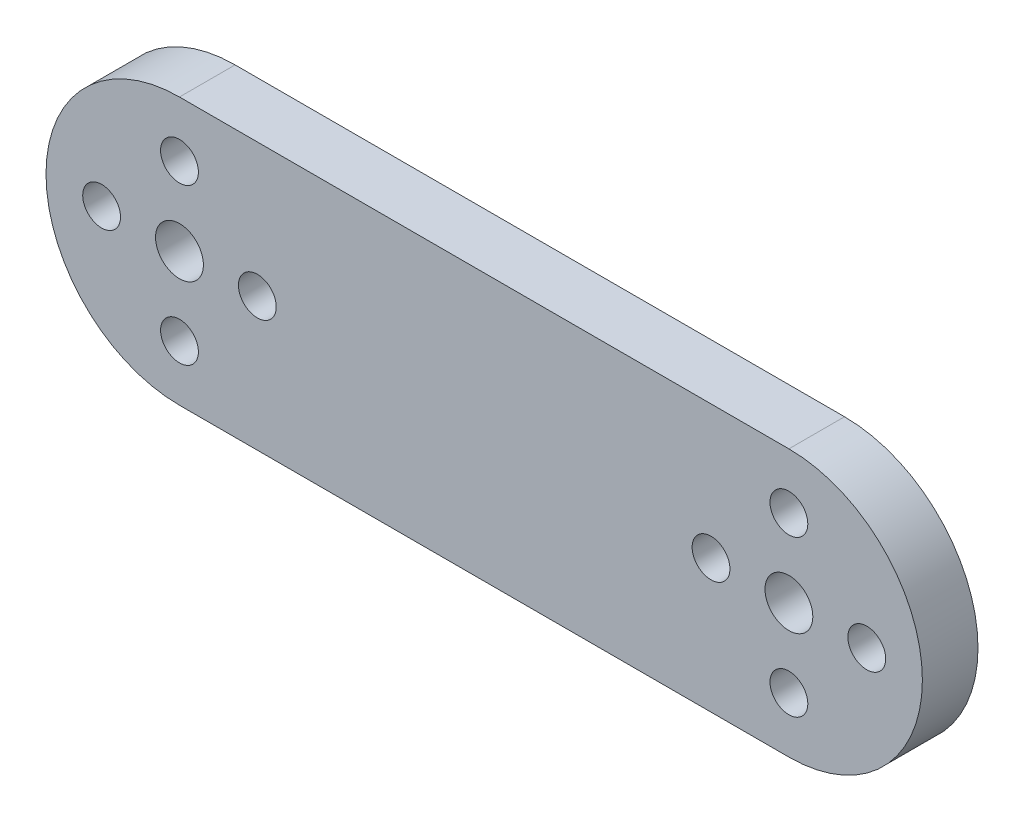
ISO-10303-21;
HEADER;
FILE_DESCRIPTION(('STEP AP214'),'2;1');
FILE_NAME('part.step','',(''),(''),'','','');
FILE_SCHEMA(('AUTOMOTIVE_DESIGN { 1 0 10303 214 1 1 1 1 }'));
ENDSEC;
DATA;
#1=APPLICATION_CONTEXT('core data for automotive mechanical design processes');
#2=APPLICATION_PROTOCOL_DEFINITION('international standard','automotive_design',2000,#1);
#3=PRODUCT_CONTEXT('',#1,'mechanical');
#4=PRODUCT('Part','Part','',(#3));
#5=PRODUCT_RELATED_PRODUCT_CATEGORY('part','',(#4));
#6=PRODUCT_DEFINITION_FORMATION('','',#4);
#7=PRODUCT_DEFINITION_CONTEXT('part definition',#1,'design');
#8=PRODUCT_DEFINITION('design','',#6,#7);
#9=PRODUCT_DEFINITION_SHAPE('','',#8);
#10=(LENGTH_UNIT() NAMED_UNIT(*) SI_UNIT(.MILLI.,.METRE.));
#11=(NAMED_UNIT(*) PLANE_ANGLE_UNIT() SI_UNIT($,.RADIAN.));
#12=(NAMED_UNIT(*) SI_UNIT($,.STERADIAN.) SOLID_ANGLE_UNIT());
#13=UNCERTAINTY_MEASURE_WITH_UNIT(LENGTH_MEASURE(1.E-05),#10,'distance_accuracy_value','');
#14=(GEOMETRIC_REPRESENTATION_CONTEXT(3) GLOBAL_UNCERTAINTY_ASSIGNED_CONTEXT((#13)) GLOBAL_UNIT_ASSIGNED_CONTEXT((#10,
#11,#12)) REPRESENTATION_CONTEXT('',''));
#15=CARTESIAN_POINT('',(0.,0.,0.));
#16=DIRECTION('',(0.,0.,1.));
#17=DIRECTION('',(1.,0.,0.));
#18=AXIS2_PLACEMENT_3D('',#15,#16,#17);
#19=CARTESIAN_POINT('',(0.,0.,5.));
#20=DIRECTION('',(0.,0.,1.));
#21=DIRECTION('',(1.,0.,0.));
#22=AXIS2_PLACEMENT_3D('',#19,#20,#21);
#23=PLANE('',#22);
#24=CARTESIAN_POINT('',(-54.7847500494002,0.,5.));
#25=DIRECTION('',(0.,0.,1.));
#26=DIRECTION('',(-1.,0.,0.));
#27=AXIS2_PLACEMENT_3D('',#24,#25,#26);
#28=CIRCLE('',#27,2.15);
#29=CARTESIAN_POINT('',(-56.9347500494002,0.,5.));
#30=VERTEX_POINT('',#29);
#31=EDGE_CURVE('E192',#30,#30,#28,.T.);
#32=ORIENTED_EDGE('',*,*,#31,.F.);
#33=EDGE_LOOP('',(#32));
#34=FACE_BOUND('',#33,.T.);
#35=CARTESIAN_POINT('',(-54.7847500494002,-7.00102849587125,5.));
#36=DIRECTION('',(0.,0.,1.));
#37=DIRECTION('',(-1.,0.,0.));
#38=AXIS2_PLACEMENT_3D('',#35,#36,#37);
#39=CIRCLE('',#38,1.7);
#40=CARTESIAN_POINT('',(-56.4847500494002,-7.00102849587125,5.));
#41=VERTEX_POINT('',#40);
#42=EDGE_CURVE('E176',#41,#41,#39,.T.);
#43=ORIENTED_EDGE('',*,*,#42,.F.);
#44=EDGE_LOOP('',(#43));
#45=FACE_BOUND('',#44,.T.);
#46=CARTESIAN_POINT('',(-7.00102849587125,0.,5.));
#47=DIRECTION('',(0.,0.,1.));
#48=DIRECTION('',(1.,0.,0.));
#49=AXIS2_PLACEMENT_3D('',#46,#47,#48);
#50=CIRCLE('',#49,1.7);
#51=CARTESIAN_POINT('',(-5.30102849587125,0.,5.));
#52=VERTEX_POINT('',#51);
#53=EDGE_CURVE('E160',#52,#52,#50,.T.);
#54=ORIENTED_EDGE('',*,*,#53,.F.);
#55=EDGE_LOOP('',(#54));
#56=FACE_BOUND('',#55,.T.);
#57=CARTESIAN_POINT('',(7.00102849587125,0.,5.));
#58=DIRECTION('',(0.,0.,1.));
#59=DIRECTION('',(1.,0.,0.));
#60=AXIS2_PLACEMENT_3D('',#57,#58,#59);
#61=CIRCLE('',#60,1.7);
#62=CARTESIAN_POINT('',(8.70102849587125,0.,5.));
#63=VERTEX_POINT('',#62);
#64=EDGE_CURVE('E144',#63,#63,#61,.T.);
#65=ORIENTED_EDGE('',*,*,#64,.F.);
#66=EDGE_LOOP('',(#65));
#67=FACE_BOUND('',#66,.T.);
#68=CARTESIAN_POINT('',(0.,0.,5.));
#69=DIRECTION('',(0.,0.,1.));
#70=DIRECTION('',(1.,0.,0.));
#71=AXIS2_PLACEMENT_3D('',#68,#69,#70);
#72=CIRCLE('',#71,2.15);
#73=CARTESIAN_POINT('',(2.15,0.,5.));
#74=VERTEX_POINT('',#73);
#75=EDGE_CURVE('E112',#74,#74,#72,.T.);
#76=ORIENTED_EDGE('',*,*,#75,.F.);
#77=EDGE_LOOP('',(#76));
#78=FACE_BOUND('',#77,.T.);
#79=CARTESIAN_POINT('',(0.,0.,5.));
#80=DIRECTION('',(0.,0.,1.));
#81=DIRECTION('',(1.,0.,0.));
#82=AXIS2_PLACEMENT_3D('',#79,#80,#81);
#83=CIRCLE('',#82,12.);
#84=CARTESIAN_POINT('',(0.,-12.,5.));
#85=VERTEX_POINT('',#84);
#86=CARTESIAN_POINT('',(0.,12.,5.));
#87=VERTEX_POINT('',#86);
#88=EDGE_CURVE('E91',#85,#87,#83,.T.);
#89=ORIENTED_EDGE('',*,*,#88,.T.);
#90=DIRECTION('',(-1.,0.,0.));
#91=VECTOR('',#90,1.);
#92=CARTESIAN_POINT('',(0.,12.,5.));
#93=LINE('',#92,#91);
#94=CARTESIAN_POINT('',(-54.7847500494002,12.,5.));
#95=VERTEX_POINT('',#94);
#96=EDGE_CURVE('E86',#87,#95,#93,.T.);
#97=ORIENTED_EDGE('',*,*,#96,.T.);
#98=CARTESIAN_POINT('',(-54.7847500494002,0.,5.));
#99=DIRECTION('',(0.,0.,1.));
#100=DIRECTION('',(1.,0.,0.));
#101=AXIS2_PLACEMENT_3D('',#98,#99,#100);
#102=CIRCLE('',#101,12.);
#103=CARTESIAN_POINT('',(-54.7847500494002,-12.,5.));
#104=VERTEX_POINT('',#103);
#105=EDGE_CURVE('E89',#95,#104,#102,.T.);
#106=ORIENTED_EDGE('',*,*,#105,.T.);
#107=DIRECTION('',(1.,0.,0.));
#108=VECTOR('',#107,1.);
#109=CARTESIAN_POINT('',(0.,-12.,5.));
#110=LINE('',#109,#108);
#111=EDGE_CURVE('E56',#104,#85,#110,.T.);
#112=ORIENTED_EDGE('',*,*,#111,.T.);
#113=EDGE_LOOP('',(#89,#97,#106,#112));
#114=FACE_BOUND('',#113,.T.);
#115=CARTESIAN_POINT('',(0.,7.00102849587125,5.));
#116=DIRECTION('',(0.,0.,1.));
#117=DIRECTION('',(1.,0.,0.));
#118=AXIS2_PLACEMENT_3D('',#115,#116,#117);
#119=CIRCLE('',#118,1.7);
#120=CARTESIAN_POINT('',(1.7,7.00102849587125,5.));
#121=VERTEX_POINT('',#120);
#122=EDGE_CURVE('E136',#121,#121,#119,.T.);
#123=ORIENTED_EDGE('',*,*,#122,.F.);
#124=EDGE_LOOP('',(#123));
#125=FACE_BOUND('',#124,.T.);
#126=CARTESIAN_POINT('',(0.,-7.00102849587125,5.));
#127=DIRECTION('',(0.,0.,1.));
#128=DIRECTION('',(1.,0.,0.));
#129=AXIS2_PLACEMENT_3D('',#126,#127,#128);
#130=CIRCLE('',#129,1.7);
#131=CARTESIAN_POINT('',(1.7,-7.00102849587125,5.));
#132=VERTEX_POINT('',#131);
#133=EDGE_CURVE('E152',#132,#132,#130,.T.);
#134=ORIENTED_EDGE('',*,*,#133,.F.);
#135=EDGE_LOOP('',(#134));
#136=FACE_BOUND('',#135,.T.);
#137=CARTESIAN_POINT('',(-47.7837215535289,0.,5.));
#138=DIRECTION('',(0.,0.,1.));
#139=DIRECTION('',(-1.,0.,0.));
#140=AXIS2_PLACEMENT_3D('',#137,#138,#139);
#141=CIRCLE('',#140,1.7);
#142=CARTESIAN_POINT('',(-49.4837215535289,0.,5.));
#143=VERTEX_POINT('',#142);
#144=EDGE_CURVE('E168',#143,#143,#141,.T.);
#145=ORIENTED_EDGE('',*,*,#144,.F.);
#146=EDGE_LOOP('',(#145));
#147=FACE_BOUND('',#146,.T.);
#148=CARTESIAN_POINT('',(-61.7857785452714,0.,5.));
#149=DIRECTION('',(0.,0.,1.));
#150=DIRECTION('',(-1.,0.,0.));
#151=AXIS2_PLACEMENT_3D('',#148,#149,#150);
#152=CIRCLE('',#151,1.7);
#153=CARTESIAN_POINT('',(-63.4857785452714,0.,5.));
#154=VERTEX_POINT('',#153);
#155=EDGE_CURVE('E184',#154,#154,#152,.T.);
#156=ORIENTED_EDGE('',*,*,#155,.F.);
#157=EDGE_LOOP('',(#156));
#158=FACE_BOUND('',#157,.T.);
#159=CARTESIAN_POINT('',(-54.7847500494002,7.00102849587124,5.));
#160=DIRECTION('',(0.,0.,1.));
#161=DIRECTION('',(-1.,0.,0.));
#162=AXIS2_PLACEMENT_3D('',#159,#160,#161);
#163=CIRCLE('',#162,1.7);
#164=CARTESIAN_POINT('',(-56.4847500494002,7.00102849587124,5.));
#165=VERTEX_POINT('',#164);
#166=EDGE_CURVE('E200',#165,#165,#163,.T.);
#167=ORIENTED_EDGE('',*,*,#166,.F.);
#168=EDGE_LOOP('',(#167));
#169=FACE_BOUND('',#168,.T.);
#170=ADVANCED_FACE('F38',(#34,#45,#56,#67,#78,#114,#125,#136,#147,#158,#169),#23,.T.);
#171=CARTESIAN_POINT('',(0.,0.,0.));
#172=DIRECTION('',(0.,0.,1.));
#173=DIRECTION('',(1.,0.,0.));
#174=AXIS2_PLACEMENT_3D('',#171,#172,#173);
#175=PLANE('',#174);
#176=CARTESIAN_POINT('',(0.,0.,0.));
#177=DIRECTION('',(0.,0.,1.));
#178=DIRECTION('',(1.,0.,0.));
#179=AXIS2_PLACEMENT_3D('',#176,#177,#178);
#180=CIRCLE('',#179,12.);
#181=CARTESIAN_POINT('',(0.,-12.,0.));
#182=VERTEX_POINT('',#181);
#183=CARTESIAN_POINT('',(0.,12.,0.));
#184=VERTEX_POINT('',#183);
#185=EDGE_CURVE('E108',#182,#184,#180,.T.);
#186=ORIENTED_EDGE('',*,*,#185,.F.);
#187=DIRECTION('',(1.,0.,0.));
#188=VECTOR('',#187,1.);
#189=CARTESIAN_POINT('',(0.,-12.,0.));
#190=LINE('',#189,#188);
#191=CARTESIAN_POINT('',(-54.7847500494002,-12.,0.));
#192=VERTEX_POINT('',#191);
#193=EDGE_CURVE('E79',#192,#182,#190,.T.);
#194=ORIENTED_EDGE('',*,*,#193,.F.);
#195=CARTESIAN_POINT('',(-54.7847500494002,0.,0.));
#196=DIRECTION('',(0.,0.,1.));
#197=DIRECTION('',(1.,0.,0.));
#198=AXIS2_PLACEMENT_3D('',#195,#196,#197);
#199=CIRCLE('',#198,12.);
#200=CARTESIAN_POINT('',(-54.7847500494002,12.,0.));
#201=VERTEX_POINT('',#200);
#202=EDGE_CURVE('E73',#201,#192,#199,.T.);
#203=ORIENTED_EDGE('',*,*,#202,.F.);
#204=DIRECTION('',(-1.,0.,0.));
#205=VECTOR('',#204,1.);
#206=CARTESIAN_POINT('',(0.,12.,0.));
#207=LINE('',#206,#205);
#208=EDGE_CURVE('E96',#184,#201,#207,.T.);
#209=ORIENTED_EDGE('',*,*,#208,.F.);
#210=EDGE_LOOP('',(#186,#194,#203,#209));
#211=FACE_BOUND('',#210,.T.);
#212=CARTESIAN_POINT('',(0.,0.,0.));
#213=DIRECTION('',(0.,0.,1.));
#214=DIRECTION('',(1.,0.,0.));
#215=AXIS2_PLACEMENT_3D('',#212,#213,#214);
#216=CIRCLE('',#215,2.15);
#217=CARTESIAN_POINT('',(2.15,0.,0.));
#218=VERTEX_POINT('',#217);
#219=EDGE_CURVE('E132',#218,#218,#216,.T.);
#220=ORIENTED_EDGE('',*,*,#219,.T.);
#221=EDGE_LOOP('',(#220));
#222=FACE_BOUND('',#221,.T.);
#223=CARTESIAN_POINT('',(0.,7.00102849587125,0.));
#224=DIRECTION('',(0.,0.,1.));
#225=DIRECTION('',(1.,0.,0.));
#226=AXIS2_PLACEMENT_3D('',#223,#224,#225);
#227=CIRCLE('',#226,1.7);
#228=CARTESIAN_POINT('',(1.7,7.00102849587125,0.));
#229=VERTEX_POINT('',#228);
#230=EDGE_CURVE('E140',#229,#229,#227,.T.);
#231=ORIENTED_EDGE('',*,*,#230,.T.);
#232=EDGE_LOOP('',(#231));
#233=FACE_BOUND('',#232,.T.);
#234=CARTESIAN_POINT('',(7.00102849587125,0.,0.));
#235=DIRECTION('',(0.,0.,1.));
#236=DIRECTION('',(1.,0.,0.));
#237=AXIS2_PLACEMENT_3D('',#234,#235,#236);
#238=CIRCLE('',#237,1.7);
#239=CARTESIAN_POINT('',(8.70102849587125,0.,0.));
#240=VERTEX_POINT('',#239);
#241=EDGE_CURVE('E148',#240,#240,#238,.T.);
#242=ORIENTED_EDGE('',*,*,#241,.T.);
#243=EDGE_LOOP('',(#242));
#244=FACE_BOUND('',#243,.T.);
#245=CARTESIAN_POINT('',(0.,-7.00102849587125,0.));
#246=DIRECTION('',(0.,0.,1.));
#247=DIRECTION('',(1.,0.,0.));
#248=AXIS2_PLACEMENT_3D('',#245,#246,#247);
#249=CIRCLE('',#248,1.7);
#250=CARTESIAN_POINT('',(1.7,-7.00102849587125,0.));
#251=VERTEX_POINT('',#250);
#252=EDGE_CURVE('E156',#251,#251,#249,.T.);
#253=ORIENTED_EDGE('',*,*,#252,.T.);
#254=EDGE_LOOP('',(#253));
#255=FACE_BOUND('',#254,.T.);
#256=CARTESIAN_POINT('',(-7.00102849587125,0.,0.));
#257=DIRECTION('',(0.,0.,1.));
#258=DIRECTION('',(1.,0.,0.));
#259=AXIS2_PLACEMENT_3D('',#256,#257,#258);
#260=CIRCLE('',#259,1.7);
#261=CARTESIAN_POINT('',(-5.30102849587125,0.,0.));
#262=VERTEX_POINT('',#261);
#263=EDGE_CURVE('E164',#262,#262,#260,.T.);
#264=ORIENTED_EDGE('',*,*,#263,.T.);
#265=EDGE_LOOP('',(#264));
#266=FACE_BOUND('',#265,.T.);
#267=CARTESIAN_POINT('',(-47.7837215535289,0.,0.));
#268=DIRECTION('',(0.,0.,1.));
#269=DIRECTION('',(-1.,0.,0.));
#270=AXIS2_PLACEMENT_3D('',#267,#268,#269);
#271=CIRCLE('',#270,1.7);
#272=CARTESIAN_POINT('',(-49.4837215535289,0.,0.));
#273=VERTEX_POINT('',#272);
#274=EDGE_CURVE('E172',#273,#273,#271,.T.);
#275=ORIENTED_EDGE('',*,*,#274,.T.);
#276=EDGE_LOOP('',(#275));
#277=FACE_BOUND('',#276,.T.);
#278=CARTESIAN_POINT('',(-54.7847500494002,-7.00102849587125,0.));
#279=DIRECTION('',(0.,0.,1.));
#280=DIRECTION('',(-1.,0.,0.));
#281=AXIS2_PLACEMENT_3D('',#278,#279,#280);
#282=CIRCLE('',#281,1.7);
#283=CARTESIAN_POINT('',(-56.4847500494002,-7.00102849587125,0.));
#284=VERTEX_POINT('',#283);
#285=EDGE_CURVE('E180',#284,#284,#282,.T.);
#286=ORIENTED_EDGE('',*,*,#285,.T.);
#287=EDGE_LOOP('',(#286));
#288=FACE_BOUND('',#287,.T.);
#289=CARTESIAN_POINT('',(-61.7857785452714,0.,0.));
#290=DIRECTION('',(0.,0.,1.));
#291=DIRECTION('',(-1.,0.,0.));
#292=AXIS2_PLACEMENT_3D('',#289,#290,#291);
#293=CIRCLE('',#292,1.7);
#294=CARTESIAN_POINT('',(-63.4857785452714,0.,0.));
#295=VERTEX_POINT('',#294);
#296=EDGE_CURVE('E188',#295,#295,#293,.T.);
#297=ORIENTED_EDGE('',*,*,#296,.T.);
#298=EDGE_LOOP('',(#297));
#299=FACE_BOUND('',#298,.T.);
#300=CARTESIAN_POINT('',(-54.7847500494002,0.,0.));
#301=DIRECTION('',(0.,0.,1.));
#302=DIRECTION('',(-1.,0.,0.));
#303=AXIS2_PLACEMENT_3D('',#300,#301,#302);
#304=CIRCLE('',#303,2.15);
#305=CARTESIAN_POINT('',(-56.9347500494002,0.,0.));
#306=VERTEX_POINT('',#305);
#307=EDGE_CURVE('E196',#306,#306,#304,.T.);
#308=ORIENTED_EDGE('',*,*,#307,.T.);
#309=EDGE_LOOP('',(#308));
#310=FACE_BOUND('',#309,.T.);
#311=CARTESIAN_POINT('',(-54.7847500494002,7.00102849587124,0.));
#312=DIRECTION('',(0.,0.,1.));
#313=DIRECTION('',(-1.,0.,0.));
#314=AXIS2_PLACEMENT_3D('',#311,#312,#313);
#315=CIRCLE('',#314,1.7);
#316=CARTESIAN_POINT('',(-56.4847500494002,7.00102849587124,0.));
#317=VERTEX_POINT('',#316);
#318=EDGE_CURVE('E204',#317,#317,#315,.T.);
#319=ORIENTED_EDGE('',*,*,#318,.T.);
#320=EDGE_LOOP('',(#319));
#321=FACE_BOUND('',#320,.T.);
#322=ADVANCED_FACE('F126',(#211,#222,#233,#244,#255,#266,#277,#288,#299,#310,#321),#175,.F.);
#323=CARTESIAN_POINT('',(0.,0.,5.));
#324=DIRECTION('',(0.,0.,-1.));
#325=DIRECTION('',(-1.,0.,0.));
#326=AXIS2_PLACEMENT_3D('',#323,#324,#325);
#327=CYLINDRICAL_SURFACE('',#326,12.);
#328=ORIENTED_EDGE('',*,*,#185,.T.);
#329=DIRECTION('',(0.,0.,-1.));
#330=VECTOR('',#329,1.);
#331=CARTESIAN_POINT('',(0.,12.,5.));
#332=LINE('',#331,#330);
#333=EDGE_CURVE('E11',#87,#184,#332,.T.);
#334=ORIENTED_EDGE('',*,*,#333,.F.);
#335=ORIENTED_EDGE('',*,*,#88,.F.);
#336=DIRECTION('',(0.,0.,-1.));
#337=VECTOR('',#336,1.);
#338=CARTESIAN_POINT('',(0.,-12.,5.));
#339=LINE('',#338,#337);
#340=EDGE_CURVE('E104',#85,#182,#339,.T.);
#341=ORIENTED_EDGE('',*,*,#340,.T.);
#342=EDGE_LOOP('',(#328,#334,#335,#341));
#343=FACE_BOUND('',#342,.T.);
#344=ADVANCED_FACE('F40',(#343),#327,.T.);
#345=CARTESIAN_POINT('',(0.,12.,5.));
#346=DIRECTION('',(0.,-1.,0.));
#347=DIRECTION('',(1.,0.,0.));
#348=AXIS2_PLACEMENT_3D('',#345,#346,#347);
#349=PLANE('',#348);
#350=ORIENTED_EDGE('',*,*,#208,.T.);
#351=DIRECTION('',(0.,0.,-1.));
#352=VECTOR('',#351,1.);
#353=CARTESIAN_POINT('',(-54.7847500494002,12.,5.));
#354=LINE('',#353,#352);
#355=EDGE_CURVE('E48',#95,#201,#354,.T.);
#356=ORIENTED_EDGE('',*,*,#355,.F.);
#357=ORIENTED_EDGE('',*,*,#96,.F.);
#358=ORIENTED_EDGE('',*,*,#333,.T.);
#359=EDGE_LOOP('',(#350,#356,#357,#358));
#360=FACE_BOUND('',#359,.T.);
#361=ADVANCED_FACE('F95',(#360),#349,.F.);
#362=CARTESIAN_POINT('',(-54.7847500494002,0.,5.));
#363=DIRECTION('',(0.,0.,-1.));
#364=DIRECTION('',(-1.,0.,0.));
#365=AXIS2_PLACEMENT_3D('',#362,#363,#364);
#366=CYLINDRICAL_SURFACE('',#365,12.);
#367=ORIENTED_EDGE('',*,*,#202,.T.);
#368=DIRECTION('',(0.,0.,-1.));
#369=VECTOR('',#368,1.);
#370=CARTESIAN_POINT('',(-54.7847500494002,-12.,5.));
#371=LINE('',#370,#369);
#372=EDGE_CURVE('E98',#104,#192,#371,.T.);
#373=ORIENTED_EDGE('',*,*,#372,.F.);
#374=ORIENTED_EDGE('',*,*,#105,.F.);
#375=ORIENTED_EDGE('',*,*,#355,.T.);
#376=EDGE_LOOP('',(#367,#373,#374,#375));
#377=FACE_BOUND('',#376,.T.);
#378=ADVANCED_FACE('F99',(#377),#366,.T.);
#379=CARTESIAN_POINT('',(0.,-12.,5.));
#380=DIRECTION('',(0.,1.,0.));
#381=DIRECTION('',(0.,0.,1.));
#382=AXIS2_PLACEMENT_3D('',#379,#380,#381);
#383=PLANE('',#382);
#384=ORIENTED_EDGE('',*,*,#193,.T.);
#385=ORIENTED_EDGE('',*,*,#340,.F.);
#386=ORIENTED_EDGE('',*,*,#111,.F.);
#387=ORIENTED_EDGE('',*,*,#372,.T.);
#388=EDGE_LOOP('',(#384,#385,#386,#387));
#389=FACE_BOUND('',#388,.T.);
#390=ADVANCED_FACE('F123',(#389),#383,.F.);
#391=CARTESIAN_POINT('',(0.,0.,5.));
#392=DIRECTION('',(0.,0.,-1.));
#393=DIRECTION('',(-1.,0.,0.));
#394=AXIS2_PLACEMENT_3D('',#391,#392,#393);
#395=CYLINDRICAL_SURFACE('',#394,2.15);
#396=ORIENTED_EDGE('',*,*,#75,.T.);
#397=EDGE_LOOP('',(#396));
#398=FACE_BOUND('',#397,.T.);
#399=ORIENTED_EDGE('',*,*,#219,.F.);
#400=EDGE_LOOP('',(#399));
#401=FACE_BOUND('',#400,.T.);
#402=ADVANCED_FACE('F226',(#398,#401),#395,.F.);
#403=CARTESIAN_POINT('',(0.,7.00102849587125,5.));
#404=DIRECTION('',(0.,0.,-1.));
#405=DIRECTION('',(-1.,0.,0.));
#406=AXIS2_PLACEMENT_3D('',#403,#404,#405);
#407=CYLINDRICAL_SURFACE('',#406,1.7);
#408=ORIENTED_EDGE('',*,*,#122,.T.);
#409=EDGE_LOOP('',(#408));
#410=FACE_BOUND('',#409,.T.);
#411=ORIENTED_EDGE('',*,*,#230,.F.);
#412=EDGE_LOOP('',(#411));
#413=FACE_BOUND('',#412,.T.);
#414=ADVANCED_FACE('F280',(#410,#413),#407,.F.);
#415=CARTESIAN_POINT('',(7.00102849587125,0.,5.));
#416=DIRECTION('',(0.,0.,-1.));
#417=DIRECTION('',(-1.,0.,0.));
#418=AXIS2_PLACEMENT_3D('',#415,#416,#417);
#419=CYLINDRICAL_SURFACE('',#418,1.7);
#420=ORIENTED_EDGE('',*,*,#64,.T.);
#421=EDGE_LOOP('',(#420));
#422=FACE_BOUND('',#421,.T.);
#423=ORIENTED_EDGE('',*,*,#241,.F.);
#424=EDGE_LOOP('',(#423));
#425=FACE_BOUND('',#424,.T.);
#426=ADVANCED_FACE('F289',(#422,#425),#419,.F.);
#427=CARTESIAN_POINT('',(0.,-7.00102849587125,5.));
#428=DIRECTION('',(0.,0.,-1.));
#429=DIRECTION('',(-1.,0.,0.));
#430=AXIS2_PLACEMENT_3D('',#427,#428,#429);
#431=CYLINDRICAL_SURFACE('',#430,1.7);
#432=ORIENTED_EDGE('',*,*,#133,.T.);
#433=EDGE_LOOP('',(#432));
#434=FACE_BOUND('',#433,.T.);
#435=ORIENTED_EDGE('',*,*,#252,.F.);
#436=EDGE_LOOP('',(#435));
#437=FACE_BOUND('',#436,.T.);
#438=ADVANCED_FACE('F298',(#434,#437),#431,.F.);
#439=CARTESIAN_POINT('',(-7.00102849587125,0.,5.));
#440=DIRECTION('',(0.,0.,-1.));
#441=DIRECTION('',(-1.,0.,0.));
#442=AXIS2_PLACEMENT_3D('',#439,#440,#441);
#443=CYLINDRICAL_SURFACE('',#442,1.7);
#444=ORIENTED_EDGE('',*,*,#53,.T.);
#445=EDGE_LOOP('',(#444));
#446=FACE_BOUND('',#445,.T.);
#447=ORIENTED_EDGE('',*,*,#263,.F.);
#448=EDGE_LOOP('',(#447));
#449=FACE_BOUND('',#448,.T.);
#450=ADVANCED_FACE('F308',(#446,#449),#443,.F.);
#451=CARTESIAN_POINT('',(-47.7837215535289,0.,5.));
#452=DIRECTION('',(0.,0.,-1.));
#453=DIRECTION('',(-1.,0.,0.));
#454=AXIS2_PLACEMENT_3D('',#451,#452,#453);
#455=CYLINDRICAL_SURFACE('',#454,1.7);
#456=ORIENTED_EDGE('',*,*,#144,.T.);
#457=EDGE_LOOP('',(#456));
#458=FACE_BOUND('',#457,.T.);
#459=ORIENTED_EDGE('',*,*,#274,.F.);
#460=EDGE_LOOP('',(#459));
#461=FACE_BOUND('',#460,.T.);
#462=ADVANCED_FACE('F318',(#458,#461),#455,.F.);
#463=CARTESIAN_POINT('',(-54.7847500494002,-7.00102849587125,5.));
#464=DIRECTION('',(0.,0.,-1.));
#465=DIRECTION('',(-1.,0.,0.));
#466=AXIS2_PLACEMENT_3D('',#463,#464,#465);
#467=CYLINDRICAL_SURFACE('',#466,1.7);
#468=ORIENTED_EDGE('',*,*,#42,.T.);
#469=EDGE_LOOP('',(#468));
#470=FACE_BOUND('',#469,.T.);
#471=ORIENTED_EDGE('',*,*,#285,.F.);
#472=EDGE_LOOP('',(#471));
#473=FACE_BOUND('',#472,.T.);
#474=ADVANCED_FACE('F328',(#470,#473),#467,.F.);
#475=CARTESIAN_POINT('',(-61.7857785452714,0.,5.));
#476=DIRECTION('',(0.,0.,-1.));
#477=DIRECTION('',(-1.,0.,0.));
#478=AXIS2_PLACEMENT_3D('',#475,#476,#477);
#479=CYLINDRICAL_SURFACE('',#478,1.7);
#480=ORIENTED_EDGE('',*,*,#155,.T.);
#481=EDGE_LOOP('',(#480));
#482=FACE_BOUND('',#481,.T.);
#483=ORIENTED_EDGE('',*,*,#296,.F.);
#484=EDGE_LOOP('',(#483));
#485=FACE_BOUND('',#484,.T.);
#486=ADVANCED_FACE('F338',(#482,#485),#479,.F.);
#487=CARTESIAN_POINT('',(-54.7847500494002,0.,5.));
#488=DIRECTION('',(0.,0.,-1.));
#489=DIRECTION('',(-1.,0.,0.));
#490=AXIS2_PLACEMENT_3D('',#487,#488,#489);
#491=CYLINDRICAL_SURFACE('',#490,2.15);
#492=ORIENTED_EDGE('',*,*,#31,.T.);
#493=EDGE_LOOP('',(#492));
#494=FACE_BOUND('',#493,.T.);
#495=ORIENTED_EDGE('',*,*,#307,.F.);
#496=EDGE_LOOP('',(#495));
#497=FACE_BOUND('',#496,.T.);
#498=ADVANCED_FACE('F348',(#494,#497),#491,.F.);
#499=CARTESIAN_POINT('',(-54.7847500494002,7.00102849587124,5.));
#500=DIRECTION('',(0.,0.,-1.));
#501=DIRECTION('',(-1.,0.,0.));
#502=AXIS2_PLACEMENT_3D('',#499,#500,#501);
#503=CYLINDRICAL_SURFACE('',#502,1.7);
#504=ORIENTED_EDGE('',*,*,#166,.T.);
#505=EDGE_LOOP('',(#504));
#506=FACE_BOUND('',#505,.T.);
#507=ORIENTED_EDGE('',*,*,#318,.F.);
#508=EDGE_LOOP('',(#507));
#509=FACE_BOUND('',#508,.T.);
#510=ADVANCED_FACE('F213',(#506,#509),#503,.F.);
#511=CLOSED_SHELL('',(#170,#322,#344,#361,#378,#390,#402,#414,#426,#438,#450,#462,#474,#486,
#498,#510));
#512=MANIFOLD_SOLID_BREP('B2',#511);
#513=ADVANCED_BREP_SHAPE_REPRESENTATION('',(#18,#512),#14);
#514=SHAPE_DEFINITION_REPRESENTATION(#9,#513);
ENDSEC;
END-ISO-10303-21;
